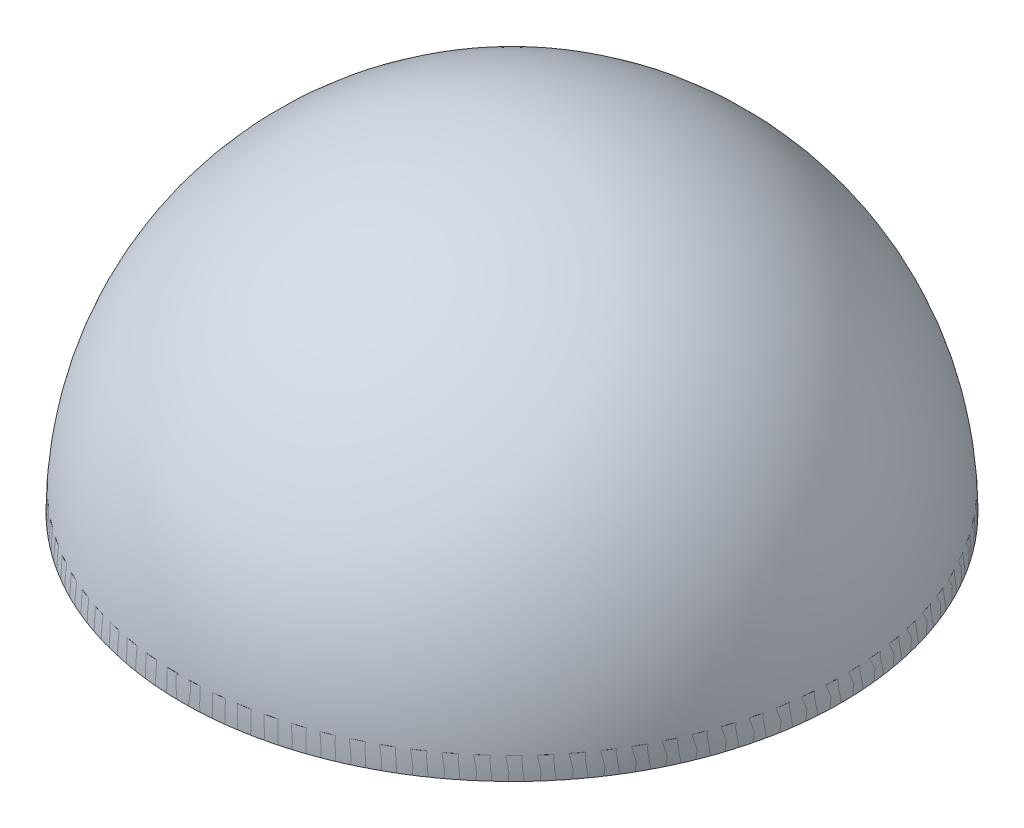
ISO-10303-21;
HEADER;
FILE_DESCRIPTION(('STEP AP214'),'2;1');
FILE_NAME('part.step','',(''),(''),'','','');
FILE_SCHEMA(('AUTOMOTIVE_DESIGN { 1 0 10303 214 1 1 1 1 }'));
ENDSEC;
DATA;
#1=APPLICATION_CONTEXT('core data for automotive mechanical design processes');
#2=APPLICATION_PROTOCOL_DEFINITION('international standard','automotive_design',2000,#1);
#3=PRODUCT_CONTEXT('',#1,'mechanical');
#4=PRODUCT('Part','Part','',(#3));
#5=PRODUCT_RELATED_PRODUCT_CATEGORY('part','',(#4));
#6=PRODUCT_DEFINITION_FORMATION('','',#4);
#7=PRODUCT_DEFINITION_CONTEXT('part definition',#1,'design');
#8=PRODUCT_DEFINITION('design','',#6,#7);
#9=PRODUCT_DEFINITION_SHAPE('','',#8);
#10=(LENGTH_UNIT() NAMED_UNIT(*) SI_UNIT(.MILLI.,.METRE.));
#11=(NAMED_UNIT(*) PLANE_ANGLE_UNIT() SI_UNIT($,.RADIAN.));
#12=(NAMED_UNIT(*) SI_UNIT($,.STERADIAN.) SOLID_ANGLE_UNIT());
#13=UNCERTAINTY_MEASURE_WITH_UNIT(LENGTH_MEASURE(1.E-05),#10,'distance_accuracy_value','');
#14=(GEOMETRIC_REPRESENTATION_CONTEXT(3) GLOBAL_UNCERTAINTY_ASSIGNED_CONTEXT((#13)) GLOBAL_UNIT_ASSIGNED_CONTEXT((#10,
#11,#12)) REPRESENTATION_CONTEXT('',''));
#15=CARTESIAN_POINT('',(0.,0.,0.));
#16=DIRECTION('',(0.,0.,1.));
#17=DIRECTION('',(1.,0.,0.));
#18=AXIS2_PLACEMENT_3D('',#15,#16,#17);
#19=CARTESIAN_POINT('',(0.,0.,0.));
#20=DIRECTION('',(0.,-1.,0.));
#21=DIRECTION('',(-1.,0.,0.));
#22=AXIS2_PLACEMENT_3D('',#19,#20,#21);
#23=SPHERICAL_SURFACE('',#22,71.);
#24=CARTESIAN_POINT('',(0.,5.,0.));
#25=DIRECTION('',(0.,-1.,0.));
#26=DIRECTION('',(0.,0.,-1.));
#27=AXIS2_PLACEMENT_3D('',#24,#25,#26);
#28=CIRCLE('',#27,70.8237248385031);
#29=CARTESIAN_POINT('',(0.,5.,-70.8237248385031));
#30=VERTEX_POINT('',#29);
#31=EDGE_CURVE('E11',#30,#30,#28,.T.);
#32=ORIENTED_EDGE('',*,*,#31,.F.);
#33=EDGE_LOOP('',(#32));
#34=FACE_BOUND('',#33,.T.);
#35=CARTESIAN_POINT('',(0.,0.,0.));
#36=DIRECTION('',(0.,-1.,0.));
#37=DIRECTION('',(0.,0.,-1.));
#38=AXIS2_PLACEMENT_3D('',#35,#36,#37);
#39=CIRCLE('',#38,71.);
#40=CARTESIAN_POINT('',(0.,0.,-71.));
#41=VERTEX_POINT('',#40);
#42=EDGE_CURVE('E59',#41,#41,#39,.T.);
#43=ORIENTED_EDGE('',*,*,#42,.T.);
#44=EDGE_LOOP('',(#43));
#45=FACE_BOUND('',#44,.T.);
#46=ADVANCED_FACE('F45',(#34,#45),#23,.F.);
#47=CARTESIAN_POINT('',(-70.8237248385031,5.,0.));
#48=DIRECTION('',(0.,-1.,0.));
#49=DIRECTION('',(0.,0.,-1.));
#50=AXIS2_PLACEMENT_3D('',#47,#48,#49);
#51=PLANE('',#50);
#52=CARTESIAN_POINT('',(0.,5.,0.));
#53=DIRECTION('',(0.,-1.,0.));
#54=DIRECTION('',(0.,0.,-1.));
#55=AXIS2_PLACEMENT_3D('',#52,#53,#54);
#56=CIRCLE('',#55,74.8331477354788);
#57=CARTESIAN_POINT('',(0.,5.,-74.8331477354788));
#58=VERTEX_POINT('',#57);
#59=EDGE_CURVE('E51',#58,#58,#56,.T.);
#60=ORIENTED_EDGE('',*,*,#59,.F.);
#61=EDGE_LOOP('',(#60));
#62=FACE_BOUND('',#61,.T.);
#63=ORIENTED_EDGE('',*,*,#31,.T.);
#64=EDGE_LOOP('',(#63));
#65=FACE_BOUND('',#64,.T.);
#66=ADVANCED_FACE('F74',(#62,#65),#51,.F.);
#67=CARTESIAN_POINT('',(0.,0.,0.));
#68=DIRECTION('',(0.,-1.,0.));
#69=DIRECTION('',(-1.,0.,0.));
#70=AXIS2_PLACEMENT_3D('',#67,#68,#69);
#71=SPHERICAL_SURFACE('',#70,75.);
#72=CARTESIAN_POINT('',(0.,0.,0.));
#73=DIRECTION('',(0.,-1.,0.));
#74=DIRECTION('',(0.,0.,-1.));
#75=AXIS2_PLACEMENT_3D('',#72,#73,#74);
#76=CIRCLE('',#75,75.);
#77=CARTESIAN_POINT('',(0.,0.,-75.));
#78=VERTEX_POINT('',#77);
#79=EDGE_CURVE('E55',#78,#78,#76,.T.);
#80=ORIENTED_EDGE('',*,*,#79,.F.);
#81=EDGE_LOOP('',(#80));
#82=FACE_BOUND('',#81,.T.);
#83=ORIENTED_EDGE('',*,*,#59,.T.);
#84=EDGE_LOOP('',(#83));
#85=FACE_BOUND('',#84,.T.);
#86=ADVANCED_FACE('F69',(#82,#85),#71,.T.);
#87=CARTESIAN_POINT('',(-75.,0.,0.));
#88=DIRECTION('',(0.,1.,0.));
#89=DIRECTION('',(0.,0.,1.));
#90=AXIS2_PLACEMENT_3D('',#87,#88,#89);
#91=PLANE('',#90);
#92=ORIENTED_EDGE('',*,*,#42,.F.);
#93=EDGE_LOOP('',(#92));
#94=FACE_BOUND('',#93,.T.);
#95=ORIENTED_EDGE('',*,*,#79,.T.);
#96=EDGE_LOOP('',(#95));
#97=FACE_BOUND('',#96,.T.);
#98=ADVANCED_FACE('F66',(#94,#97),#91,.F.);
#99=CLOSED_SHELL('',(#46,#66,#86,#98));
#100=MANIFOLD_SOLID_BREP('B2',#99);
#101=CARTESIAN_POINT('',(1.63031105136491E-13,0.,0.));
#102=DIRECTION('',(0.,0.,1.));
#103=DIRECTION('',(-1.,0.,0.));
#104=AXIS2_PLACEMENT_3D('',#101,#102,#103);
#105=SPHERICAL_SURFACE('',#104,71.);
#106=CARTESIAN_POINT('',(1.63031105136491E-13,0.,0.));
#107=DIRECTION('',(0.,-1.,0.));
#108=DIRECTION('',(0.,0.,1.));
#109=AXIS2_PLACEMENT_3D('',#106,#107,#108);
#110=SPHERICAL_SURFACE('',#109,71.);
#111=CARTESIAN_POINT('',(1.63031105136491E-13,0.,0.));
#112=DIRECTION('',(0.,-1.,0.));
#113=DIRECTION('',(0.,0.,1.));
#114=AXIS2_PLACEMENT_3D('',#111,#112,#113);
#115=CIRCLE('',#114,71.);
#116=CARTESIAN_POINT('',(3.17367217999036E-13,0.,71.));
#117=VERTEX_POINT('',#116);
#118=EDGE_CURVE('E114',#117,#117,#115,.T.);
#119=ORIENTED_EDGE('',*,*,#118,.T.);
#120=EDGE_LOOP('',(#119));
#121=FACE_BOUND('',#120,.T.);
#122=ADVANCED_FACE('F107',(#121),#110,.F.);
#123=CARTESIAN_POINT('',(1.63031105136491E-13,0.,0.));
#124=DIRECTION('',(0.,0.,1.));
#125=DIRECTION('',(-1.,0.,0.));
#126=AXIS2_PLACEMENT_3D('',#123,#124,#125);
#127=SPHERICAL_SURFACE('',#126,75.);
#128=CARTESIAN_POINT('',(1.63031105136491E-13,0.,0.));
#129=DIRECTION('',(0.,-1.,0.));
#130=DIRECTION('',(0.,0.,1.));
#131=AXIS2_PLACEMENT_3D('',#128,#129,#130);
#132=SPHERICAL_SURFACE('',#131,75.);
#133=CARTESIAN_POINT('',(1.63031105136491E-13,0.,0.));
#134=DIRECTION('',(0.,-1.,0.));
#135=DIRECTION('',(0.,0.,1.));
#136=AXIS2_PLACEMENT_3D('',#133,#134,#135);
#137=CIRCLE('',#136,75.);
#138=CARTESIAN_POINT('',(3.26062210272982E-13,0.,75.));
#139=VERTEX_POINT('',#138);
#140=EDGE_CURVE('E44',#139,#139,#137,.T.);
#141=ORIENTED_EDGE('',*,*,#140,.F.);
#142=EDGE_LOOP('',(#141));
#143=FACE_BOUND('',#142,.T.);
#144=ADVANCED_FACE('F109',(#143),#132,.T.);
#145=CARTESIAN_POINT('',(1.63031105136491E-13,0.,0.));
#146=DIRECTION('',(0.,-1.,0.));
#147=DIRECTION('',(0.,0.,1.));
#148=AXIS2_PLACEMENT_3D('',#145,#146,#147);
#149=PLANE('',#148);
#150=ORIENTED_EDGE('',*,*,#140,.T.);
#151=EDGE_LOOP('',(#150));
#152=FACE_BOUND('',#151,.T.);
#153=ORIENTED_EDGE('',*,*,#118,.F.);
#154=EDGE_LOOP('',(#153));
#155=FACE_BOUND('',#154,.T.);
#156=ADVANCED_FACE('F121',(#152,#155),#149,.T.);
#157=CLOSED_SHELL('',(#122,#144,#156));
#158=MANIFOLD_SOLID_BREP('B6',#157);
#159=ADVANCED_BREP_SHAPE_REPRESENTATION('',(#18,#100,#158),#14);
#160=SHAPE_DEFINITION_REPRESENTATION(#9,#159);
ENDSEC;
END-ISO-10303-21;
